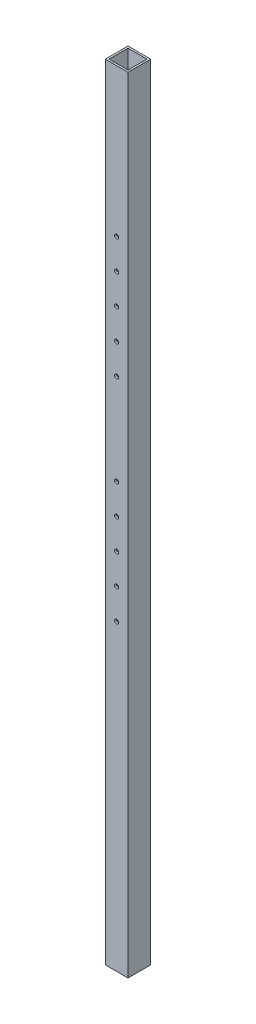
ISO-10303-21;
HEADER;
FILE_DESCRIPTION(('STEP AP214'),'2;1');
FILE_NAME('part.step','',(''),(''),'','','');
FILE_SCHEMA(('AUTOMOTIVE_DESIGN { 1 0 10303 214 1 1 1 1 }'));
ENDSEC;
DATA;
#1=APPLICATION_CONTEXT('core data for automotive mechanical design processes');
#2=APPLICATION_PROTOCOL_DEFINITION('international standard','automotive_design',2000,#1);
#3=PRODUCT_CONTEXT('',#1,'mechanical');
#4=PRODUCT('Part','Part','',(#3));
#5=PRODUCT_RELATED_PRODUCT_CATEGORY('part','',(#4));
#6=PRODUCT_DEFINITION_FORMATION('','',#4);
#7=PRODUCT_DEFINITION_CONTEXT('part definition',#1,'design');
#8=PRODUCT_DEFINITION('design','',#6,#7);
#9=PRODUCT_DEFINITION_SHAPE('','',#8);
#10=(LENGTH_UNIT() NAMED_UNIT(*) SI_UNIT(.MILLI.,.METRE.));
#11=(NAMED_UNIT(*) PLANE_ANGLE_UNIT() SI_UNIT($,.RADIAN.));
#12=(NAMED_UNIT(*) SI_UNIT($,.STERADIAN.) SOLID_ANGLE_UNIT());
#13=UNCERTAINTY_MEASURE_WITH_UNIT(LENGTH_MEASURE(1.E-05),#10,'distance_accuracy_value','');
#14=(GEOMETRIC_REPRESENTATION_CONTEXT(3) GLOBAL_UNCERTAINTY_ASSIGNED_CONTEXT((#13)) GLOBAL_UNIT_ASSIGNED_CONTEXT((#10,
#11,#12)) REPRESENTATION_CONTEXT('',''));
#15=CARTESIAN_POINT('',(0.,0.,0.));
#16=DIRECTION('',(0.,0.,1.));
#17=DIRECTION('',(1.,0.,0.));
#18=AXIS2_PLACEMENT_3D('',#15,#16,#17);
#19=CARTESIAN_POINT('',(0.,328.6633,0.));
#20=DIRECTION('',(0.,1.,0.));
#21=DIRECTION('',(0.,0.,1.));
#22=AXIS2_PLACEMENT_3D('',#19,#20,#21);
#23=PLANE('',#22);
#24=DIRECTION('',(1.,0.,0.));
#25=VECTOR('',#24,1.);
#26=CARTESIAN_POINT('',(9.525,328.6633,9.525));
#27=LINE('',#26,#25);
#28=CARTESIAN_POINT('',(-9.525,328.6633,9.525));
#29=VERTEX_POINT('',#28);
#30=CARTESIAN_POINT('',(9.525,328.6633,9.525));
#31=VERTEX_POINT('',#30);
#32=EDGE_CURVE('E140',#29,#31,#27,.T.);
#33=ORIENTED_EDGE('',*,*,#32,.T.);
#34=DIRECTION('',(0.,0.,-1.));
#35=VECTOR('',#34,1.);
#36=CARTESIAN_POINT('',(9.525,328.6633,-9.525));
#37=LINE('',#36,#35);
#38=CARTESIAN_POINT('',(9.525,328.6633,-9.525));
#39=VERTEX_POINT('',#38);
#40=EDGE_CURVE('E143',#31,#39,#37,.T.);
#41=ORIENTED_EDGE('',*,*,#40,.T.);
#42=DIRECTION('',(-1.,0.,0.));
#43=VECTOR('',#42,1.);
#44=CARTESIAN_POINT('',(9.525,328.6633,-9.525));
#45=LINE('',#44,#43);
#46=CARTESIAN_POINT('',(-9.525,328.6633,-9.525));
#47=VERTEX_POINT('',#46);
#48=EDGE_CURVE('E146',#39,#47,#45,.T.);
#49=ORIENTED_EDGE('',*,*,#48,.T.);
#50=DIRECTION('',(0.,0.,1.));
#51=VECTOR('',#50,1.);
#52=CARTESIAN_POINT('',(-9.525,328.6633,-9.525));
#53=LINE('',#52,#51);
#54=EDGE_CURVE('E148',#47,#29,#53,.T.);
#55=ORIENTED_EDGE('',*,*,#54,.T.);
#56=EDGE_LOOP('',(#33,#41,#49,#55));
#57=FACE_BOUND('',#56,.T.);
#58=DIRECTION('',(0.,0.,-1.));
#59=VECTOR('',#58,1.);
#60=CARTESIAN_POINT('',(7.9375,328.6633,-7.9375));
#61=LINE('',#60,#59);
#62=CARTESIAN_POINT('',(7.9375,328.6633,7.9375));
#63=VERTEX_POINT('',#62);
#64=CARTESIAN_POINT('',(7.9375,328.6633,-7.9375));
#65=VERTEX_POINT('',#64);
#66=EDGE_CURVE('E110',#63,#65,#61,.T.);
#67=ORIENTED_EDGE('',*,*,#66,.F.);
#68=DIRECTION('',(1.,0.,0.));
#69=VECTOR('',#68,1.);
#70=CARTESIAN_POINT('',(7.9375,328.6633,7.9375));
#71=LINE('',#70,#69);
#72=CARTESIAN_POINT('',(-7.9375,328.6633,7.9375));
#73=VERTEX_POINT('',#72);
#74=EDGE_CURVE('E101',#73,#63,#71,.T.);
#75=ORIENTED_EDGE('',*,*,#74,.F.);
#76=DIRECTION('',(0.,0.,1.));
#77=VECTOR('',#76,1.);
#78=CARTESIAN_POINT('',(-7.9375,328.6633,-7.9375));
#79=LINE('',#78,#77);
#80=CARTESIAN_POINT('',(-7.9375,328.6633,-7.9375));
#81=VERTEX_POINT('',#80);
#82=EDGE_CURVE('E124',#81,#73,#79,.T.);
#83=ORIENTED_EDGE('',*,*,#82,.F.);
#84=DIRECTION('',(-1.,0.,0.));
#85=VECTOR('',#84,1.);
#86=CARTESIAN_POINT('',(7.9375,328.6633,-7.9375));
#87=LINE('',#86,#85);
#88=EDGE_CURVE('E122',#65,#81,#87,.T.);
#89=ORIENTED_EDGE('',*,*,#88,.F.);
#90=EDGE_LOOP('',(#67,#75,#83,#89));
#91=FACE_BOUND('',#90,.T.);
#92=ADVANCED_FACE('F34',(#57,#91),#23,.T.);
#93=CARTESIAN_POINT('',(0.,-328.6633,0.));
#94=DIRECTION('',(0.,1.,0.));
#95=DIRECTION('',(0.,0.,1.));
#96=AXIS2_PLACEMENT_3D('',#93,#94,#95);
#97=PLANE('',#96);
#98=DIRECTION('',(1.,0.,0.));
#99=VECTOR('',#98,1.);
#100=CARTESIAN_POINT('',(9.525,-328.6633,9.525));
#101=LINE('',#100,#99);
#102=CARTESIAN_POINT('',(-9.525,-328.6633,9.525));
#103=VERTEX_POINT('',#102);
#104=CARTESIAN_POINT('',(9.525,-328.6633,9.525));
#105=VERTEX_POINT('',#104);
#106=EDGE_CURVE('E118',#103,#105,#101,.T.);
#107=ORIENTED_EDGE('',*,*,#106,.F.);
#108=DIRECTION('',(0.,0.,1.));
#109=VECTOR('',#108,1.);
#110=CARTESIAN_POINT('',(-9.525,-328.6633,-9.525));
#111=LINE('',#110,#109);
#112=CARTESIAN_POINT('',(-9.525,-328.6633,-9.525));
#113=VERTEX_POINT('',#112);
#114=EDGE_CURVE('E144',#113,#103,#111,.T.);
#115=ORIENTED_EDGE('',*,*,#114,.F.);
#116=DIRECTION('',(-1.,0.,0.));
#117=VECTOR('',#116,1.);
#118=CARTESIAN_POINT('',(9.525,-328.6633,-9.525));
#119=LINE('',#118,#117);
#120=CARTESIAN_POINT('',(9.525,-328.6633,-9.525));
#121=VERTEX_POINT('',#120);
#122=EDGE_CURVE('E155',#121,#113,#119,.T.);
#123=ORIENTED_EDGE('',*,*,#122,.F.);
#124=DIRECTION('',(0.,0.,-1.));
#125=VECTOR('',#124,1.);
#126=CARTESIAN_POINT('',(9.525,-328.6633,-9.525));
#127=LINE('',#126,#125);
#128=EDGE_CURVE('E153',#105,#121,#127,.T.);
#129=ORIENTED_EDGE('',*,*,#128,.F.);
#130=EDGE_LOOP('',(#107,#115,#123,#129));
#131=FACE_BOUND('',#130,.T.);
#132=DIRECTION('',(1.,0.,0.));
#133=VECTOR('',#132,1.);
#134=CARTESIAN_POINT('',(7.9375,-328.6633,7.9375));
#135=LINE('',#134,#133);
#136=CARTESIAN_POINT('',(-7.9375,-328.6633,7.9375));
#137=VERTEX_POINT('',#136);
#138=CARTESIAN_POINT('',(7.9375,-328.6633,7.9375));
#139=VERTEX_POINT('',#138);
#140=EDGE_CURVE('E59',#137,#139,#135,.T.);
#141=ORIENTED_EDGE('',*,*,#140,.T.);
#142=DIRECTION('',(0.,0.,-1.));
#143=VECTOR('',#142,1.);
#144=CARTESIAN_POINT('',(7.9375,-328.6633,-7.9375));
#145=LINE('',#144,#143);
#146=CARTESIAN_POINT('',(7.9375,-328.6633,-7.9375));
#147=VERTEX_POINT('',#146);
#148=EDGE_CURVE('E117',#139,#147,#145,.T.);
#149=ORIENTED_EDGE('',*,*,#148,.T.);
#150=DIRECTION('',(-1.,0.,0.));
#151=VECTOR('',#150,1.);
#152=CARTESIAN_POINT('',(7.9375,-328.6633,-7.9375));
#153=LINE('',#152,#151);
#154=CARTESIAN_POINT('',(-7.9375,-328.6633,-7.9375));
#155=VERTEX_POINT('',#154);
#156=EDGE_CURVE('E132',#147,#155,#153,.T.);
#157=ORIENTED_EDGE('',*,*,#156,.T.);
#158=DIRECTION('',(0.,0.,1.));
#159=VECTOR('',#158,1.);
#160=CARTESIAN_POINT('',(-7.9375,-328.6633,-7.9375));
#161=LINE('',#160,#159);
#162=EDGE_CURVE('E111',#155,#137,#161,.T.);
#163=ORIENTED_EDGE('',*,*,#162,.T.);
#164=EDGE_LOOP('',(#141,#149,#157,#163));
#165=FACE_BOUND('',#164,.T.);
#166=ADVANCED_FACE('F298',(#131,#165),#97,.F.);
#167=CARTESIAN_POINT('',(9.525,328.6633,9.525));
#168=DIRECTION('',(0.,0.,-1.));
#169=DIRECTION('',(-1.,0.,0.));
#170=AXIS2_PLACEMENT_3D('',#167,#168,#169);
#171=PLANE('',#170);
#172=CARTESIAN_POINT('',(0.,204.7367,9.525));
#173=DIRECTION('',(0.,0.,1.));
#174=DIRECTION('',(1.,0.,0.));
#175=AXIS2_PLACEMENT_3D('',#172,#173,#174);
#176=CIRCLE('',#175,1.7145);
#177=CARTESIAN_POINT('',(1.71450000000001,204.7367,9.525));
#178=VERTEX_POINT('',#177);
#179=EDGE_CURVE('E406',#178,#178,#176,.T.);
#180=ORIENTED_EDGE('',*,*,#179,.F.);
#181=EDGE_LOOP('',(#180));
#182=FACE_BOUND('',#181,.T.);
#183=CARTESIAN_POINT('',(0.,179.3367,9.525));
#184=DIRECTION('',(0.,0.,1.));
#185=DIRECTION('',(1.,0.,0.));
#186=AXIS2_PLACEMENT_3D('',#183,#184,#185);
#187=CIRCLE('',#186,1.7145);
#188=CARTESIAN_POINT('',(1.71450000000001,179.3367,9.525));
#189=VERTEX_POINT('',#188);
#190=EDGE_CURVE('E229',#189,#189,#187,.T.);
#191=ORIENTED_EDGE('',*,*,#190,.F.);
#192=EDGE_LOOP('',(#191));
#193=FACE_BOUND('',#192,.T.);
#194=CARTESIAN_POINT('',(0.,153.9367,9.525));
#195=DIRECTION('',(0.,0.,1.));
#196=DIRECTION('',(1.,0.,0.));
#197=AXIS2_PLACEMENT_3D('',#194,#195,#196);
#198=CIRCLE('',#197,1.7145);
#199=CARTESIAN_POINT('',(1.71450000000001,153.9367,9.525));
#200=VERTEX_POINT('',#199);
#201=EDGE_CURVE('E226',#200,#200,#198,.T.);
#202=ORIENTED_EDGE('',*,*,#201,.F.);
#203=EDGE_LOOP('',(#202));
#204=FACE_BOUND('',#203,.T.);
#205=CARTESIAN_POINT('',(0.,128.5367,9.525));
#206=DIRECTION('',(0.,0.,1.));
#207=DIRECTION('',(1.,0.,0.));
#208=AXIS2_PLACEMENT_3D('',#205,#206,#207);
#209=CIRCLE('',#208,1.7145);
#210=CARTESIAN_POINT('',(1.71450000000001,128.5367,9.525));
#211=VERTEX_POINT('',#210);
#212=EDGE_CURVE('E245',#211,#211,#209,.T.);
#213=ORIENTED_EDGE('',*,*,#212,.F.);
#214=EDGE_LOOP('',(#213));
#215=FACE_BOUND('',#214,.T.);
#216=CARTESIAN_POINT('',(0.,103.1367,9.525));
#217=DIRECTION('',(0.,0.,1.));
#218=DIRECTION('',(1.,0.,0.));
#219=AXIS2_PLACEMENT_3D('',#216,#217,#218);
#220=CIRCLE('',#219,1.7145);
#221=CARTESIAN_POINT('',(1.71450000000001,103.1367,9.525));
#222=VERTEX_POINT('',#221);
#223=EDGE_CURVE('E252',#222,#222,#220,.T.);
#224=ORIENTED_EDGE('',*,*,#223,.F.);
#225=EDGE_LOOP('',(#224));
#226=FACE_BOUND('',#225,.T.);
#227=CARTESIAN_POINT('',(0.,-49.2633,9.525));
#228=DIRECTION('',(0.,0.,1.));
#229=DIRECTION('',(1.,0.,0.));
#230=AXIS2_PLACEMENT_3D('',#227,#228,#229);
#231=CIRCLE('',#230,1.7145);
#232=CARTESIAN_POINT('',(1.71450000000001,-49.2633,9.525));
#233=VERTEX_POINT('',#232);
#234=EDGE_CURVE('E268',#233,#233,#231,.T.);
#235=ORIENTED_EDGE('',*,*,#234,.F.);
#236=EDGE_LOOP('',(#235));
#237=FACE_BOUND('',#236,.T.);
#238=CARTESIAN_POINT('',(0.,-74.6633,9.525));
#239=DIRECTION('',(0.,0.,1.));
#240=DIRECTION('',(1.,0.,0.));
#241=AXIS2_PLACEMENT_3D('',#238,#239,#240);
#242=CIRCLE('',#241,1.7145);
#243=CARTESIAN_POINT('',(1.71450000000001,-74.6633,9.525));
#244=VERTEX_POINT('',#243);
#245=EDGE_CURVE('E271',#244,#244,#242,.T.);
#246=ORIENTED_EDGE('',*,*,#245,.F.);
#247=EDGE_LOOP('',(#246));
#248=FACE_BOUND('',#247,.T.);
#249=ORIENTED_EDGE('',*,*,#106,.T.);
#250=DIRECTION('',(0.,-1.,0.));
#251=VECTOR('',#250,1.);
#252=CARTESIAN_POINT('',(9.525,328.6633,9.525));
#253=LINE('',#252,#251);
#254=EDGE_CURVE('E166',#31,#105,#253,.T.);
#255=ORIENTED_EDGE('',*,*,#254,.F.);
#256=ORIENTED_EDGE('',*,*,#32,.F.);
#257=DIRECTION('',(0.,-1.,0.));
#258=VECTOR('',#257,1.);
#259=CARTESIAN_POINT('',(-9.525,328.6633,9.525));
#260=LINE('',#259,#258);
#261=EDGE_CURVE('E150',#29,#103,#260,.T.);
#262=ORIENTED_EDGE('',*,*,#261,.T.);
#263=EDGE_LOOP('',(#249,#255,#256,#262));
#264=FACE_BOUND('',#263,.T.);
#265=CARTESIAN_POINT('',(0.,-23.8633,9.525));
#266=DIRECTION('',(0.,0.,1.));
#267=DIRECTION('',(1.,0.,0.));
#268=AXIS2_PLACEMENT_3D('',#265,#266,#267);
#269=CIRCLE('',#268,1.7145);
#270=CARTESIAN_POINT('',(1.71450000000001,-23.8633,9.525));
#271=VERTEX_POINT('',#270);
#272=EDGE_CURVE('E176',#271,#271,#269,.T.);
#273=ORIENTED_EDGE('',*,*,#272,.F.);
#274=EDGE_LOOP('',(#273));
#275=FACE_BOUND('',#274,.T.);
#276=CARTESIAN_POINT('',(0.,1.5367,9.525));
#277=DIRECTION('',(0.,0.,1.));
#278=DIRECTION('',(1.,0.,0.));
#279=AXIS2_PLACEMENT_3D('',#276,#277,#278);
#280=CIRCLE('',#279,1.7145);
#281=CARTESIAN_POINT('',(1.71450000000001,1.5367,9.525));
#282=VERTEX_POINT('',#281);
#283=EDGE_CURVE('E182',#282,#282,#280,.T.);
#284=ORIENTED_EDGE('',*,*,#283,.F.);
#285=EDGE_LOOP('',(#284));
#286=FACE_BOUND('',#285,.T.);
#287=CARTESIAN_POINT('',(0.,26.9367,9.525));
#288=DIRECTION('',(0.,0.,1.));
#289=DIRECTION('',(1.,0.,0.));
#290=AXIS2_PLACEMENT_3D('',#287,#288,#289);
#291=CIRCLE('',#290,1.7145);
#292=CARTESIAN_POINT('',(1.71450000000001,26.9367,9.525));
#293=VERTEX_POINT('',#292);
#294=EDGE_CURVE('E188',#293,#293,#291,.T.);
#295=ORIENTED_EDGE('',*,*,#294,.F.);
#296=EDGE_LOOP('',(#295));
#297=FACE_BOUND('',#296,.T.);
#298=ADVANCED_FACE('F303',(#182,#193,#204,#215,#226,#237,#248,#264,#275,#286,#297),#171,.F.);
#299=CARTESIAN_POINT('',(9.525,328.6633,-9.525));
#300=DIRECTION('',(-1.,0.,0.));
#301=DIRECTION('',(0.,0.,1.));
#302=AXIS2_PLACEMENT_3D('',#299,#300,#301);
#303=PLANE('',#302);
#304=ORIENTED_EDGE('',*,*,#128,.T.);
#305=DIRECTION('',(0.,-1.,0.));
#306=VECTOR('',#305,1.);
#307=CARTESIAN_POINT('',(9.525,328.6633,-9.525));
#308=LINE('',#307,#306);
#309=EDGE_CURVE('E163',#39,#121,#308,.T.);
#310=ORIENTED_EDGE('',*,*,#309,.F.);
#311=ORIENTED_EDGE('',*,*,#40,.F.);
#312=ORIENTED_EDGE('',*,*,#254,.T.);
#313=EDGE_LOOP('',(#304,#310,#311,#312));
#314=FACE_BOUND('',#313,.T.);
#315=ADVANCED_FACE('F309',(#314),#303,.F.);
#316=CARTESIAN_POINT('',(9.525,328.6633,-9.525));
#317=DIRECTION('',(0.,0.,1.));
#318=DIRECTION('',(1.,0.,0.));
#319=AXIS2_PLACEMENT_3D('',#316,#317,#318);
#320=PLANE('',#319);
#321=CARTESIAN_POINT('',(0.,204.7367,-9.52500000000001));
#322=DIRECTION('',(0.,0.,1.));
#323=DIRECTION('',(1.,0.,0.));
#324=AXIS2_PLACEMENT_3D('',#321,#322,#323);
#325=CIRCLE('',#324,1.7145);
#326=CARTESIAN_POINT('',(1.71450000000001,204.7367,-9.52500000000001));
#327=VERTEX_POINT('',#326);
#328=EDGE_CURVE('E405',#327,#327,#325,.T.);
#329=ORIENTED_EDGE('',*,*,#328,.T.);
#330=EDGE_LOOP('',(#329));
#331=FACE_BOUND('',#330,.T.);
#332=CARTESIAN_POINT('',(0.,179.3367,-9.52500000000001));
#333=DIRECTION('',(0.,0.,1.));
#334=DIRECTION('',(1.,0.,0.));
#335=AXIS2_PLACEMENT_3D('',#332,#333,#334);
#336=CIRCLE('',#335,1.7145);
#337=CARTESIAN_POINT('',(1.71450000000001,179.3367,-9.52500000000001));
#338=VERTEX_POINT('',#337);
#339=EDGE_CURVE('E222',#338,#338,#336,.T.);
#340=ORIENTED_EDGE('',*,*,#339,.T.);
#341=EDGE_LOOP('',(#340));
#342=FACE_BOUND('',#341,.T.);
#343=CARTESIAN_POINT('',(0.,153.9367,-9.52500000000001));
#344=DIRECTION('',(0.,0.,1.));
#345=DIRECTION('',(1.,0.,0.));
#346=AXIS2_PLACEMENT_3D('',#343,#344,#345);
#347=CIRCLE('',#346,1.7145);
#348=CARTESIAN_POINT('',(1.71450000000001,153.9367,-9.52500000000001));
#349=VERTEX_POINT('',#348);
#350=EDGE_CURVE('E218',#349,#349,#347,.T.);
#351=ORIENTED_EDGE('',*,*,#350,.T.);
#352=EDGE_LOOP('',(#351));
#353=FACE_BOUND('',#352,.T.);
#354=CARTESIAN_POINT('',(0.,128.5367,-9.52500000000001));
#355=DIRECTION('',(0.,0.,1.));
#356=DIRECTION('',(1.,0.,0.));
#357=AXIS2_PLACEMENT_3D('',#354,#355,#356);
#358=CIRCLE('',#357,1.7145);
#359=CARTESIAN_POINT('',(1.71450000000001,128.5367,-9.52500000000001));
#360=VERTEX_POINT('',#359);
#361=EDGE_CURVE('E214',#360,#360,#358,.T.);
#362=ORIENTED_EDGE('',*,*,#361,.T.);
#363=EDGE_LOOP('',(#362));
#364=FACE_BOUND('',#363,.T.);
#365=CARTESIAN_POINT('',(0.,103.1367,-9.52500000000001));
#366=DIRECTION('',(0.,0.,1.));
#367=DIRECTION('',(1.,0.,0.));
#368=AXIS2_PLACEMENT_3D('',#365,#366,#367);
#369=CIRCLE('',#368,1.7145);
#370=CARTESIAN_POINT('',(1.71450000000001,103.1367,-9.52500000000001));
#371=VERTEX_POINT('',#370);
#372=EDGE_CURVE('E209',#371,#371,#369,.T.);
#373=ORIENTED_EDGE('',*,*,#372,.T.);
#374=EDGE_LOOP('',(#373));
#375=FACE_BOUND('',#374,.T.);
#376=CARTESIAN_POINT('',(0.,-49.2633,-9.52500000000001));
#377=DIRECTION('',(0.,0.,1.));
#378=DIRECTION('',(1.,0.,0.));
#379=AXIS2_PLACEMENT_3D('',#376,#377,#378);
#380=CIRCLE('',#379,1.7145);
#381=CARTESIAN_POINT('',(1.71450000000001,-49.2633,-9.52500000000001));
#382=VERTEX_POINT('',#381);
#383=EDGE_CURVE('E262',#382,#382,#380,.T.);
#384=ORIENTED_EDGE('',*,*,#383,.T.);
#385=EDGE_LOOP('',(#384));
#386=FACE_BOUND('',#385,.T.);
#387=CARTESIAN_POINT('',(0.,-74.6633,-9.52500000000001));
#388=DIRECTION('',(0.,0.,1.));
#389=DIRECTION('',(1.,0.,0.));
#390=AXIS2_PLACEMENT_3D('',#387,#388,#389);
#391=CIRCLE('',#390,1.7145);
#392=CARTESIAN_POINT('',(1.71450000000001,-74.6633,-9.52500000000001));
#393=VERTEX_POINT('',#392);
#394=EDGE_CURVE('E173',#393,#393,#391,.T.);
#395=ORIENTED_EDGE('',*,*,#394,.T.);
#396=EDGE_LOOP('',(#395));
#397=FACE_BOUND('',#396,.T.);
#398=ORIENTED_EDGE('',*,*,#122,.T.);
#399=DIRECTION('',(0.,-1.,0.));
#400=VECTOR('',#399,1.);
#401=CARTESIAN_POINT('',(-9.525,328.6633,-9.525));
#402=LINE('',#401,#400);
#403=EDGE_CURVE('E160',#47,#113,#402,.T.);
#404=ORIENTED_EDGE('',*,*,#403,.F.);
#405=ORIENTED_EDGE('',*,*,#48,.F.);
#406=ORIENTED_EDGE('',*,*,#309,.T.);
#407=EDGE_LOOP('',(#398,#404,#405,#406));
#408=FACE_BOUND('',#407,.T.);
#409=CARTESIAN_POINT('',(0.,-23.8633,-9.52500000000001));
#410=DIRECTION('',(0.,0.,1.));
#411=DIRECTION('',(1.,0.,0.));
#412=AXIS2_PLACEMENT_3D('',#409,#410,#411);
#413=CIRCLE('',#412,1.7145);
#414=CARTESIAN_POINT('',(1.71450000000001,-23.8633,-9.52500000000001));
#415=VERTEX_POINT('',#414);
#416=EDGE_CURVE('E194',#415,#415,#413,.T.);
#417=ORIENTED_EDGE('',*,*,#416,.T.);
#418=EDGE_LOOP('',(#417));
#419=FACE_BOUND('',#418,.T.);
#420=CARTESIAN_POINT('',(0.,1.5367,-9.52500000000001));
#421=DIRECTION('',(0.,0.,1.));
#422=DIRECTION('',(1.,0.,0.));
#423=AXIS2_PLACEMENT_3D('',#420,#421,#422);
#424=CIRCLE('',#423,1.7145);
#425=CARTESIAN_POINT('',(1.71450000000001,1.5367,-9.52500000000001));
#426=VERTEX_POINT('',#425);
#427=EDGE_CURVE('E200',#426,#426,#424,.T.);
#428=ORIENTED_EDGE('',*,*,#427,.T.);
#429=EDGE_LOOP('',(#428));
#430=FACE_BOUND('',#429,.T.);
#431=CARTESIAN_POINT('',(0.,26.9367,-9.52500000000001));
#432=DIRECTION('',(0.,0.,1.));
#433=DIRECTION('',(1.,0.,0.));
#434=AXIS2_PLACEMENT_3D('',#431,#432,#433);
#435=CIRCLE('',#434,1.7145);
#436=CARTESIAN_POINT('',(1.71450000000001,26.9367,-9.52500000000001));
#437=VERTEX_POINT('',#436);
#438=EDGE_CURVE('E11',#437,#437,#435,.T.);
#439=ORIENTED_EDGE('',*,*,#438,.T.);
#440=EDGE_LOOP('',(#439));
#441=FACE_BOUND('',#440,.T.);
#442=ADVANCED_FACE('F291',(#331,#342,#353,#364,#375,#386,#397,#408,#419,#430,#441),#320,.F.);
#443=CARTESIAN_POINT('',(-9.525,328.6633,-9.525));
#444=DIRECTION('',(1.,0.,0.));
#445=DIRECTION('',(0.,0.,-1.));
#446=AXIS2_PLACEMENT_3D('',#443,#444,#445);
#447=PLANE('',#446);
#448=ORIENTED_EDGE('',*,*,#114,.T.);
#449=ORIENTED_EDGE('',*,*,#261,.F.);
#450=ORIENTED_EDGE('',*,*,#54,.F.);
#451=ORIENTED_EDGE('',*,*,#403,.T.);
#452=EDGE_LOOP('',(#448,#449,#450,#451));
#453=FACE_BOUND('',#452,.T.);
#454=ADVANCED_FACE('F282',(#453),#447,.F.);
#455=CARTESIAN_POINT('',(7.9375,328.6633,7.9375));
#456=DIRECTION('',(0.,0.,-1.));
#457=DIRECTION('',(-1.,0.,0.));
#458=AXIS2_PLACEMENT_3D('',#455,#456,#457);
#459=PLANE('',#458);
#460=CARTESIAN_POINT('',(0.,204.7367,7.9375));
#461=DIRECTION('',(0.,0.,-1.));
#462=DIRECTION('',(-1.,0.,0.));
#463=AXIS2_PLACEMENT_3D('',#460,#461,#462);
#464=CIRCLE('',#463,1.7145);
#465=CARTESIAN_POINT('',(-1.71449999999999,204.7367,7.9375));
#466=VERTEX_POINT('',#465);
#467=EDGE_CURVE('E234',#466,#466,#464,.T.);
#468=ORIENTED_EDGE('',*,*,#467,.F.);
#469=EDGE_LOOP('',(#468));
#470=FACE_BOUND('',#469,.T.);
#471=CARTESIAN_POINT('',(0.,179.3367,7.9375));
#472=DIRECTION('',(0.,0.,-1.));
#473=DIRECTION('',(-1.,0.,0.));
#474=AXIS2_PLACEMENT_3D('',#471,#472,#473);
#475=CIRCLE('',#474,1.7145);
#476=CARTESIAN_POINT('',(-1.71449999999999,179.3367,7.9375));
#477=VERTEX_POINT('',#476);
#478=EDGE_CURVE('E221',#477,#477,#475,.T.);
#479=ORIENTED_EDGE('',*,*,#478,.F.);
#480=EDGE_LOOP('',(#479));
#481=FACE_BOUND('',#480,.T.);
#482=CARTESIAN_POINT('',(0.,153.9367,7.9375));
#483=DIRECTION('',(0.,0.,-1.));
#484=DIRECTION('',(-1.,0.,0.));
#485=AXIS2_PLACEMENT_3D('',#482,#483,#484);
#486=CIRCLE('',#485,1.7145);
#487=CARTESIAN_POINT('',(-1.71449999999999,153.9367,7.9375));
#488=VERTEX_POINT('',#487);
#489=EDGE_CURVE('E217',#488,#488,#486,.T.);
#490=ORIENTED_EDGE('',*,*,#489,.F.);
#491=EDGE_LOOP('',(#490));
#492=FACE_BOUND('',#491,.T.);
#493=CARTESIAN_POINT('',(0.,128.5367,7.9375));
#494=DIRECTION('',(0.,0.,-1.));
#495=DIRECTION('',(-1.,0.,0.));
#496=AXIS2_PLACEMENT_3D('',#493,#494,#495);
#497=CIRCLE('',#496,1.7145);
#498=CARTESIAN_POINT('',(-1.71449999999999,128.5367,7.9375));
#499=VERTEX_POINT('',#498);
#500=EDGE_CURVE('E213',#499,#499,#497,.T.);
#501=ORIENTED_EDGE('',*,*,#500,.F.);
#502=EDGE_LOOP('',(#501));
#503=FACE_BOUND('',#502,.T.);
#504=CARTESIAN_POINT('',(0.,103.1367,7.9375));
#505=DIRECTION('',(0.,0.,-1.));
#506=DIRECTION('',(-1.,0.,0.));
#507=AXIS2_PLACEMENT_3D('',#504,#505,#506);
#508=CIRCLE('',#507,1.7145);
#509=CARTESIAN_POINT('',(-1.71449999999999,103.1367,7.9375));
#510=VERTEX_POINT('',#509);
#511=EDGE_CURVE('E208',#510,#510,#508,.T.);
#512=ORIENTED_EDGE('',*,*,#511,.F.);
#513=EDGE_LOOP('',(#512));
#514=FACE_BOUND('',#513,.T.);
#515=CARTESIAN_POINT('',(0.,-49.2633,7.9375));
#516=DIRECTION('',(0.,0.,-1.));
#517=DIRECTION('',(-1.,0.,0.));
#518=AXIS2_PLACEMENT_3D('',#515,#516,#517);
#519=CIRCLE('',#518,1.7145);
#520=CARTESIAN_POINT('',(-1.71449999999999,-49.2633,7.9375));
#521=VERTEX_POINT('',#520);
#522=EDGE_CURVE('E265',#521,#521,#519,.T.);
#523=ORIENTED_EDGE('',*,*,#522,.F.);
#524=EDGE_LOOP('',(#523));
#525=FACE_BOUND('',#524,.T.);
#526=CARTESIAN_POINT('',(0.,-74.6633,7.9375));
#527=DIRECTION('',(0.,0.,-1.));
#528=DIRECTION('',(-1.,0.,0.));
#529=AXIS2_PLACEMENT_3D('',#526,#527,#528);
#530=CIRCLE('',#529,1.7145);
#531=CARTESIAN_POINT('',(-1.71449999999999,-74.6633,7.9375));
#532=VERTEX_POINT('',#531);
#533=EDGE_CURVE('E130',#532,#532,#530,.T.);
#534=ORIENTED_EDGE('',*,*,#533,.F.);
#535=EDGE_LOOP('',(#534));
#536=FACE_BOUND('',#535,.T.);
#537=ORIENTED_EDGE('',*,*,#140,.F.);
#538=DIRECTION('',(0.,-1.,0.));
#539=VECTOR('',#538,1.);
#540=CARTESIAN_POINT('',(-7.9375,328.6633,7.9375));
#541=LINE('',#540,#539);
#542=EDGE_CURVE('E106',#73,#137,#541,.T.);
#543=ORIENTED_EDGE('',*,*,#542,.F.);
#544=ORIENTED_EDGE('',*,*,#74,.T.);
#545=DIRECTION('',(0.,-1.,0.));
#546=VECTOR('',#545,1.);
#547=CARTESIAN_POINT('',(7.9375,328.6633,7.9375));
#548=LINE('',#547,#546);
#549=EDGE_CURVE('E105',#63,#139,#548,.T.);
#550=ORIENTED_EDGE('',*,*,#549,.T.);
#551=EDGE_LOOP('',(#537,#543,#544,#550));
#552=FACE_BOUND('',#551,.T.);
#553=CARTESIAN_POINT('',(0.,-23.8633,7.9375));
#554=DIRECTION('',(0.,0.,-1.));
#555=DIRECTION('',(-1.,0.,0.));
#556=AXIS2_PLACEMENT_3D('',#553,#554,#555);
#557=CIRCLE('',#556,1.7145);
#558=CARTESIAN_POINT('',(-1.71449999999999,-23.8633,7.9375));
#559=VERTEX_POINT('',#558);
#560=EDGE_CURVE('E169',#559,#559,#557,.T.);
#561=ORIENTED_EDGE('',*,*,#560,.F.);
#562=EDGE_LOOP('',(#561));
#563=FACE_BOUND('',#562,.T.);
#564=CARTESIAN_POINT('',(0.,1.5367,7.9375));
#565=DIRECTION('',(0.,0.,-1.));
#566=DIRECTION('',(-1.,0.,0.));
#567=AXIS2_PLACEMENT_3D('',#564,#565,#566);
#568=CIRCLE('',#567,1.7145);
#569=CARTESIAN_POINT('',(-1.71449999999999,1.5367,7.9375));
#570=VERTEX_POINT('',#569);
#571=EDGE_CURVE('E179',#570,#570,#568,.T.);
#572=ORIENTED_EDGE('',*,*,#571,.F.);
#573=EDGE_LOOP('',(#572));
#574=FACE_BOUND('',#573,.T.);
#575=CARTESIAN_POINT('',(0.,26.9367,7.9375));
#576=DIRECTION('',(0.,0.,-1.));
#577=DIRECTION('',(-1.,0.,0.));
#578=AXIS2_PLACEMENT_3D('',#575,#576,#577);
#579=CIRCLE('',#578,1.7145);
#580=CARTESIAN_POINT('',(-1.71449999999999,26.9367,7.9375));
#581=VERTEX_POINT('',#580);
#582=EDGE_CURVE('E185',#581,#581,#579,.T.);
#583=ORIENTED_EDGE('',*,*,#582,.F.);
#584=EDGE_LOOP('',(#583));
#585=FACE_BOUND('',#584,.T.);
#586=ADVANCED_FACE('F103',(#470,#481,#492,#503,#514,#525,#536,#552,#563,#574,#585),#459,.T.);
#587=CARTESIAN_POINT('',(7.9375,328.6633,-7.9375));
#588=DIRECTION('',(-1.,0.,0.));
#589=DIRECTION('',(0.,0.,1.));
#590=AXIS2_PLACEMENT_3D('',#587,#588,#589);
#591=PLANE('',#590);
#592=ORIENTED_EDGE('',*,*,#148,.F.);
#593=ORIENTED_EDGE('',*,*,#549,.F.);
#594=ORIENTED_EDGE('',*,*,#66,.T.);
#595=DIRECTION('',(0.,-1.,0.));
#596=VECTOR('',#595,1.);
#597=CARTESIAN_POINT('',(7.9375,328.6633,-7.9375));
#598=LINE('',#597,#596);
#599=EDGE_CURVE('E119',#65,#147,#598,.T.);
#600=ORIENTED_EDGE('',*,*,#599,.T.);
#601=EDGE_LOOP('',(#592,#593,#594,#600));
#602=FACE_BOUND('',#601,.T.);
#603=ADVANCED_FACE('F114',(#602),#591,.T.);
#604=CARTESIAN_POINT('',(7.9375,328.6633,-7.9375));
#605=DIRECTION('',(0.,0.,1.));
#606=DIRECTION('',(1.,0.,0.));
#607=AXIS2_PLACEMENT_3D('',#604,#605,#606);
#608=PLANE('',#607);
#609=CARTESIAN_POINT('',(0.,204.7367,-7.9375));
#610=DIRECTION('',(0.,0.,1.));
#611=DIRECTION('',(1.,0.,0.));
#612=AXIS2_PLACEMENT_3D('',#609,#610,#611);
#613=CIRCLE('',#612,1.7145);
#614=CARTESIAN_POINT('',(1.71450000000001,204.7367,-7.9375));
#615=VERTEX_POINT('',#614);
#616=EDGE_CURVE('E38',#615,#615,#613,.T.);
#617=ORIENTED_EDGE('',*,*,#616,.F.);
#618=EDGE_LOOP('',(#617));
#619=FACE_BOUND('',#618,.T.);
#620=CARTESIAN_POINT('',(0.,179.3367,-7.9375));
#621=DIRECTION('',(0.,0.,1.));
#622=DIRECTION('',(1.,0.,0.));
#623=AXIS2_PLACEMENT_3D('',#620,#621,#622);
#624=CIRCLE('',#623,1.7145);
#625=CARTESIAN_POINT('',(1.71450000000001,179.3367,-7.9375));
#626=VERTEX_POINT('',#625);
#627=EDGE_CURVE('E219',#626,#626,#624,.T.);
#628=ORIENTED_EDGE('',*,*,#627,.F.);
#629=EDGE_LOOP('',(#628));
#630=FACE_BOUND('',#629,.T.);
#631=CARTESIAN_POINT('',(0.,153.9367,-7.9375));
#632=DIRECTION('',(0.,0.,1.));
#633=DIRECTION('',(1.,0.,0.));
#634=AXIS2_PLACEMENT_3D('',#631,#632,#633);
#635=CIRCLE('',#634,1.7145);
#636=CARTESIAN_POINT('',(1.71450000000001,153.9367,-7.9375));
#637=VERTEX_POINT('',#636);
#638=EDGE_CURVE('E215',#637,#637,#635,.T.);
#639=ORIENTED_EDGE('',*,*,#638,.F.);
#640=EDGE_LOOP('',(#639));
#641=FACE_BOUND('',#640,.T.);
#642=CARTESIAN_POINT('',(0.,128.5367,-7.9375));
#643=DIRECTION('',(0.,0.,1.));
#644=DIRECTION('',(1.,0.,0.));
#645=AXIS2_PLACEMENT_3D('',#642,#643,#644);
#646=CIRCLE('',#645,1.7145);
#647=CARTESIAN_POINT('',(1.71450000000001,128.5367,-7.9375));
#648=VERTEX_POINT('',#647);
#649=EDGE_CURVE('E210',#648,#648,#646,.T.);
#650=ORIENTED_EDGE('',*,*,#649,.F.);
#651=EDGE_LOOP('',(#650));
#652=FACE_BOUND('',#651,.T.);
#653=CARTESIAN_POINT('',(0.,103.1367,-7.9375));
#654=DIRECTION('',(0.,0.,1.));
#655=DIRECTION('',(1.,0.,0.));
#656=AXIS2_PLACEMENT_3D('',#653,#654,#655);
#657=CIRCLE('',#656,1.7145);
#658=CARTESIAN_POINT('',(1.71450000000001,103.1367,-7.9375));
#659=VERTEX_POINT('',#658);
#660=EDGE_CURVE('E205',#659,#659,#657,.T.);
#661=ORIENTED_EDGE('',*,*,#660,.F.);
#662=EDGE_LOOP('',(#661));
#663=FACE_BOUND('',#662,.T.);
#664=CARTESIAN_POINT('',(0.,-49.2633,-7.9375));
#665=DIRECTION('',(0.,0.,1.));
#666=DIRECTION('',(1.,0.,0.));
#667=AXIS2_PLACEMENT_3D('',#664,#665,#666);
#668=CIRCLE('',#667,1.7145);
#669=CARTESIAN_POINT('',(1.71450000000001,-49.2633,-7.9375));
#670=VERTEX_POINT('',#669);
#671=EDGE_CURVE('E259',#670,#670,#668,.T.);
#672=ORIENTED_EDGE('',*,*,#671,.F.);
#673=EDGE_LOOP('',(#672));
#674=FACE_BOUND('',#673,.T.);
#675=CARTESIAN_POINT('',(0.,-74.6633,-7.9375));
#676=DIRECTION('',(0.,0.,1.));
#677=DIRECTION('',(1.,0.,0.));
#678=AXIS2_PLACEMENT_3D('',#675,#676,#677);
#679=CIRCLE('',#678,1.7145);
#680=CARTESIAN_POINT('',(1.71450000000001,-74.6633,-7.9375));
#681=VERTEX_POINT('',#680);
#682=EDGE_CURVE('E170',#681,#681,#679,.T.);
#683=ORIENTED_EDGE('',*,*,#682,.F.);
#684=EDGE_LOOP('',(#683));
#685=FACE_BOUND('',#684,.T.);
#686=ORIENTED_EDGE('',*,*,#156,.F.);
#687=ORIENTED_EDGE('',*,*,#599,.F.);
#688=ORIENTED_EDGE('',*,*,#88,.T.);
#689=DIRECTION('',(0.,-1.,0.));
#690=VECTOR('',#689,1.);
#691=CARTESIAN_POINT('',(-7.9375,328.6633,-7.9375));
#692=LINE('',#691,#690);
#693=EDGE_CURVE('E51',#81,#155,#692,.T.);
#694=ORIENTED_EDGE('',*,*,#693,.T.);
#695=EDGE_LOOP('',(#686,#687,#688,#694));
#696=FACE_BOUND('',#695,.T.);
#697=CARTESIAN_POINT('',(0.,-23.8633,-7.9375));
#698=DIRECTION('',(0.,0.,1.));
#699=DIRECTION('',(1.,0.,0.));
#700=AXIS2_PLACEMENT_3D('',#697,#698,#699);
#701=CIRCLE('',#700,1.7145);
#702=CARTESIAN_POINT('',(1.71450000000001,-23.8633,-7.9375));
#703=VERTEX_POINT('',#702);
#704=EDGE_CURVE('E191',#703,#703,#701,.T.);
#705=ORIENTED_EDGE('',*,*,#704,.F.);
#706=EDGE_LOOP('',(#705));
#707=FACE_BOUND('',#706,.T.);
#708=CARTESIAN_POINT('',(0.,1.5367,-7.9375));
#709=DIRECTION('',(0.,0.,1.));
#710=DIRECTION('',(1.,0.,0.));
#711=AXIS2_PLACEMENT_3D('',#708,#709,#710);
#712=CIRCLE('',#711,1.7145);
#713=CARTESIAN_POINT('',(1.71450000000001,1.5367,-7.9375));
#714=VERTEX_POINT('',#713);
#715=EDGE_CURVE('E197',#714,#714,#712,.T.);
#716=ORIENTED_EDGE('',*,*,#715,.F.);
#717=EDGE_LOOP('',(#716));
#718=FACE_BOUND('',#717,.T.);
#719=CARTESIAN_POINT('',(0.,26.9367,-7.9375));
#720=DIRECTION('',(0.,0.,1.));
#721=DIRECTION('',(1.,0.,0.));
#722=AXIS2_PLACEMENT_3D('',#719,#720,#721);
#723=CIRCLE('',#722,1.7145);
#724=CARTESIAN_POINT('',(1.71450000000001,26.9367,-7.9375));
#725=VERTEX_POINT('',#724);
#726=EDGE_CURVE('E43',#725,#725,#723,.T.);
#727=ORIENTED_EDGE('',*,*,#726,.F.);
#728=EDGE_LOOP('',(#727));
#729=FACE_BOUND('',#728,.T.);
#730=ADVANCED_FACE('F289',(#619,#630,#641,#652,#663,#674,#685,#696,#707,#718,#729),#608,.T.);
#731=CARTESIAN_POINT('',(-7.9375,328.6633,-7.9375));
#732=DIRECTION('',(1.,0.,0.));
#733=DIRECTION('',(0.,0.,-1.));
#734=AXIS2_PLACEMENT_3D('',#731,#732,#733);
#735=PLANE('',#734);
#736=ORIENTED_EDGE('',*,*,#162,.F.);
#737=ORIENTED_EDGE('',*,*,#693,.F.);
#738=ORIENTED_EDGE('',*,*,#82,.T.);
#739=ORIENTED_EDGE('',*,*,#542,.T.);
#740=EDGE_LOOP('',(#736,#737,#738,#739));
#741=FACE_BOUND('',#740,.T.);
#742=ADVANCED_FACE('F352',(#741),#735,.T.);
#743=CARTESIAN_POINT('',(0.,-74.6633,-9.52500000000001));
#744=DIRECTION('',(0.,0.,1.));
#745=DIRECTION('',(1.,0.,0.));
#746=AXIS2_PLACEMENT_3D('',#743,#744,#745);
#747=CYLINDRICAL_SURFACE('',#746,1.7145);
#748=ORIENTED_EDGE('',*,*,#682,.T.);
#749=EDGE_LOOP('',(#748));
#750=FACE_BOUND('',#749,.T.);
#751=ORIENTED_EDGE('',*,*,#394,.F.);
#752=EDGE_LOOP('',(#751));
#753=FACE_BOUND('',#752,.T.);
#754=ADVANCED_FACE('F359',(#750,#753),#747,.F.);
#755=ORIENTED_EDGE('',*,*,#533,.T.);
#756=EDGE_LOOP('',(#755));
#757=FACE_BOUND('',#756,.T.);
#758=ORIENTED_EDGE('',*,*,#245,.T.);
#759=EDGE_LOOP('',(#758));
#760=FACE_BOUND('',#759,.T.);
#761=ADVANCED_FACE('F278',(#757,#760),#747,.F.);
#762=CARTESIAN_POINT('',(0.,-49.2633,-9.52500000000001));
#763=DIRECTION('',(0.,0.,1.));
#764=DIRECTION('',(1.,0.,0.));
#765=AXIS2_PLACEMENT_3D('',#762,#763,#764);
#766=CYLINDRICAL_SURFACE('',#765,1.7145);
#767=ORIENTED_EDGE('',*,*,#522,.T.);
#768=EDGE_LOOP('',(#767));
#769=FACE_BOUND('',#768,.T.);
#770=ORIENTED_EDGE('',*,*,#234,.T.);
#771=EDGE_LOOP('',(#770));
#772=FACE_BOUND('',#771,.T.);
#773=ADVANCED_FACE('F321',(#769,#772),#766,.F.);
#774=CARTESIAN_POINT('',(0.,-23.8633,-9.52500000000001));
#775=DIRECTION('',(0.,0.,1.));
#776=DIRECTION('',(1.,0.,0.));
#777=AXIS2_PLACEMENT_3D('',#774,#775,#776);
#778=CYLINDRICAL_SURFACE('',#777,1.7145);
#779=ORIENTED_EDGE('',*,*,#560,.T.);
#780=EDGE_LOOP('',(#779));
#781=FACE_BOUND('',#780,.T.);
#782=ORIENTED_EDGE('',*,*,#272,.T.);
#783=EDGE_LOOP('',(#782));
#784=FACE_BOUND('',#783,.T.);
#785=ADVANCED_FACE('F317',(#781,#784),#778,.F.);
#786=CARTESIAN_POINT('',(0.,1.5367,-9.52500000000001));
#787=DIRECTION('',(0.,0.,1.));
#788=DIRECTION('',(1.,0.,0.));
#789=AXIS2_PLACEMENT_3D('',#786,#787,#788);
#790=CYLINDRICAL_SURFACE('',#789,1.7145);
#791=ORIENTED_EDGE('',*,*,#571,.T.);
#792=EDGE_LOOP('',(#791));
#793=FACE_BOUND('',#792,.T.);
#794=ORIENTED_EDGE('',*,*,#283,.T.);
#795=EDGE_LOOP('',(#794));
#796=FACE_BOUND('',#795,.T.);
#797=ADVANCED_FACE('F320',(#793,#796),#790,.F.);
#798=CARTESIAN_POINT('',(0.,26.9367,-9.52500000000001));
#799=DIRECTION('',(0.,0.,1.));
#800=DIRECTION('',(1.,0.,0.));
#801=AXIS2_PLACEMENT_3D('',#798,#799,#800);
#802=CYLINDRICAL_SURFACE('',#801,1.7145);
#803=ORIENTED_EDGE('',*,*,#582,.T.);
#804=EDGE_LOOP('',(#803));
#805=FACE_BOUND('',#804,.T.);
#806=ORIENTED_EDGE('',*,*,#294,.T.);
#807=EDGE_LOOP('',(#806));
#808=FACE_BOUND('',#807,.T.);
#809=ADVANCED_FACE('F325',(#805,#808),#802,.F.);
#810=CARTESIAN_POINT('',(0.,-49.2633,-9.52500000000001));
#811=DIRECTION('',(0.,0.,1.));
#812=DIRECTION('',(1.,0.,0.));
#813=AXIS2_PLACEMENT_3D('',#810,#811,#812);
#814=CYLINDRICAL_SURFACE('',#813,1.7145);
#815=ORIENTED_EDGE('',*,*,#671,.T.);
#816=EDGE_LOOP('',(#815));
#817=FACE_BOUND('',#816,.T.);
#818=ORIENTED_EDGE('',*,*,#383,.F.);
#819=EDGE_LOOP('',(#818));
#820=FACE_BOUND('',#819,.T.);
#821=ADVANCED_FACE('F329',(#817,#820),#814,.F.);
#822=CARTESIAN_POINT('',(0.,-23.8633,-9.52500000000001));
#823=DIRECTION('',(0.,0.,1.));
#824=DIRECTION('',(1.,0.,0.));
#825=AXIS2_PLACEMENT_3D('',#822,#823,#824);
#826=CYLINDRICAL_SURFACE('',#825,1.7145);
#827=ORIENTED_EDGE('',*,*,#704,.T.);
#828=EDGE_LOOP('',(#827));
#829=FACE_BOUND('',#828,.T.);
#830=ORIENTED_EDGE('',*,*,#416,.F.);
#831=EDGE_LOOP('',(#830));
#832=FACE_BOUND('',#831,.T.);
#833=ADVANCED_FACE('F331',(#829,#832),#826,.F.);
#834=CARTESIAN_POINT('',(0.,1.5367,-9.52500000000001));
#835=DIRECTION('',(0.,0.,1.));
#836=DIRECTION('',(1.,0.,0.));
#837=AXIS2_PLACEMENT_3D('',#834,#835,#836);
#838=CYLINDRICAL_SURFACE('',#837,1.7145);
#839=ORIENTED_EDGE('',*,*,#715,.T.);
#840=EDGE_LOOP('',(#839));
#841=FACE_BOUND('',#840,.T.);
#842=ORIENTED_EDGE('',*,*,#427,.F.);
#843=EDGE_LOOP('',(#842));
#844=FACE_BOUND('',#843,.T.);
#845=ADVANCED_FACE('F333',(#841,#844),#838,.F.);
#846=CARTESIAN_POINT('',(0.,26.9367,-9.52500000000001));
#847=DIRECTION('',(0.,0.,1.));
#848=DIRECTION('',(1.,0.,0.));
#849=AXIS2_PLACEMENT_3D('',#846,#847,#848);
#850=CYLINDRICAL_SURFACE('',#849,1.7145);
#851=ORIENTED_EDGE('',*,*,#726,.T.);
#852=EDGE_LOOP('',(#851));
#853=FACE_BOUND('',#852,.T.);
#854=ORIENTED_EDGE('',*,*,#438,.F.);
#855=EDGE_LOOP('',(#854));
#856=FACE_BOUND('',#855,.T.);
#857=ADVANCED_FACE('F36',(#853,#856),#850,.F.);
#858=CARTESIAN_POINT('',(0.,103.1367,-9.52500000000001));
#859=DIRECTION('',(0.,0.,1.));
#860=DIRECTION('',(1.,0.,0.));
#861=AXIS2_PLACEMENT_3D('',#858,#859,#860);
#862=CYLINDRICAL_SURFACE('',#861,1.7145);
#863=ORIENTED_EDGE('',*,*,#660,.T.);
#864=EDGE_LOOP('',(#863));
#865=FACE_BOUND('',#864,.T.);
#866=ORIENTED_EDGE('',*,*,#372,.F.);
#867=EDGE_LOOP('',(#866));
#868=FACE_BOUND('',#867,.T.);
#869=ADVANCED_FACE('F340',(#865,#868),#862,.F.);
#870=ORIENTED_EDGE('',*,*,#511,.T.);
#871=EDGE_LOOP('',(#870));
#872=FACE_BOUND('',#871,.T.);
#873=ORIENTED_EDGE('',*,*,#223,.T.);
#874=EDGE_LOOP('',(#873));
#875=FACE_BOUND('',#874,.T.);
#876=ADVANCED_FACE('F375',(#872,#875),#862,.F.);
#877=CARTESIAN_POINT('',(0.,128.5367,-9.52500000000001));
#878=DIRECTION('',(0.,0.,1.));
#879=DIRECTION('',(1.,0.,0.));
#880=AXIS2_PLACEMENT_3D('',#877,#878,#879);
#881=CYLINDRICAL_SURFACE('',#880,1.7145);
#882=ORIENTED_EDGE('',*,*,#649,.T.);
#883=EDGE_LOOP('',(#882));
#884=FACE_BOUND('',#883,.T.);
#885=ORIENTED_EDGE('',*,*,#361,.F.);
#886=EDGE_LOOP('',(#885));
#887=FACE_BOUND('',#886,.T.);
#888=ADVANCED_FACE('F377',(#884,#887),#881,.F.);
#889=ORIENTED_EDGE('',*,*,#500,.T.);
#890=EDGE_LOOP('',(#889));
#891=FACE_BOUND('',#890,.T.);
#892=ORIENTED_EDGE('',*,*,#212,.T.);
#893=EDGE_LOOP('',(#892));
#894=FACE_BOUND('',#893,.T.);
#895=ADVANCED_FACE('F380',(#891,#894),#881,.F.);
#896=CARTESIAN_POINT('',(0.,153.9367,-9.52500000000001));
#897=DIRECTION('',(0.,0.,1.));
#898=DIRECTION('',(1.,0.,0.));
#899=AXIS2_PLACEMENT_3D('',#896,#897,#898);
#900=CYLINDRICAL_SURFACE('',#899,1.7145);
#901=ORIENTED_EDGE('',*,*,#638,.T.);
#902=EDGE_LOOP('',(#901));
#903=FACE_BOUND('',#902,.T.);
#904=ORIENTED_EDGE('',*,*,#350,.F.);
#905=EDGE_LOOP('',(#904));
#906=FACE_BOUND('',#905,.T.);
#907=ADVANCED_FACE('F382',(#903,#906),#900,.F.);
#908=ORIENTED_EDGE('',*,*,#489,.T.);
#909=EDGE_LOOP('',(#908));
#910=FACE_BOUND('',#909,.T.);
#911=ORIENTED_EDGE('',*,*,#201,.T.);
#912=EDGE_LOOP('',(#911));
#913=FACE_BOUND('',#912,.T.);
#914=ADVANCED_FACE('F385',(#910,#913),#900,.F.);
#915=CARTESIAN_POINT('',(0.,179.3367,-9.52500000000001));
#916=DIRECTION('',(0.,0.,1.));
#917=DIRECTION('',(1.,0.,0.));
#918=AXIS2_PLACEMENT_3D('',#915,#916,#917);
#919=CYLINDRICAL_SURFACE('',#918,1.7145);
#920=ORIENTED_EDGE('',*,*,#627,.T.);
#921=EDGE_LOOP('',(#920));
#922=FACE_BOUND('',#921,.T.);
#923=ORIENTED_EDGE('',*,*,#339,.F.);
#924=EDGE_LOOP('',(#923));
#925=FACE_BOUND('',#924,.T.);
#926=ADVANCED_FACE('F387',(#922,#925),#919,.F.);
#927=ORIENTED_EDGE('',*,*,#478,.T.);
#928=EDGE_LOOP('',(#927));
#929=FACE_BOUND('',#928,.T.);
#930=ORIENTED_EDGE('',*,*,#190,.T.);
#931=EDGE_LOOP('',(#930));
#932=FACE_BOUND('',#931,.T.);
#933=ADVANCED_FACE('F390',(#929,#932),#919,.F.);
#934=CARTESIAN_POINT('',(0.,204.7367,-9.52500000000001));
#935=DIRECTION('',(0.,0.,1.));
#936=DIRECTION('',(1.,0.,0.));
#937=AXIS2_PLACEMENT_3D('',#934,#935,#936);
#938=CYLINDRICAL_SURFACE('',#937,1.7145);
#939=ORIENTED_EDGE('',*,*,#616,.T.);
#940=EDGE_LOOP('',(#939));
#941=FACE_BOUND('',#940,.T.);
#942=ORIENTED_EDGE('',*,*,#328,.F.);
#943=EDGE_LOOP('',(#942));
#944=FACE_BOUND('',#943,.T.);
#945=ADVANCED_FACE('F391',(#941,#944),#938,.F.);
#946=ORIENTED_EDGE('',*,*,#467,.T.);
#947=EDGE_LOOP('',(#946));
#948=FACE_BOUND('',#947,.T.);
#949=ORIENTED_EDGE('',*,*,#179,.T.);
#950=EDGE_LOOP('',(#949));
#951=FACE_BOUND('',#950,.T.);
#952=ADVANCED_FACE('F393',(#948,#951),#938,.F.);
#953=CLOSED_SHELL('',(#92,#166,#298,#315,#442,#454,#586,#603,#730,#742,#754,#761,#773,#785,#797,
#809,#821,#833,#845,#857,#869,#876,#888,#895,#907,#914,#926,#933,#945,#952));
#954=MANIFOLD_SOLID_BREP('B2',#953);
#955=ADVANCED_BREP_SHAPE_REPRESENTATION('',(#18,#954),#14);
#956=SHAPE_DEFINITION_REPRESENTATION(#9,#955);
ENDSEC;
END-ISO-10303-21;
